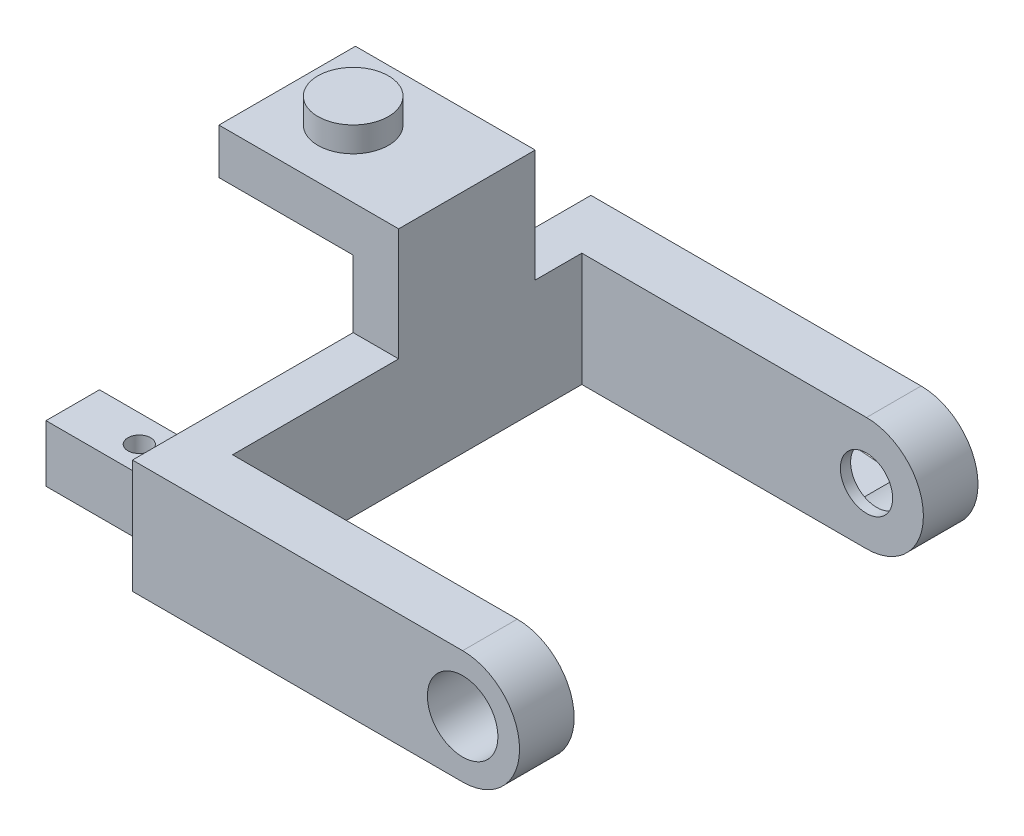
ISO-10303-21;
HEADER;
FILE_DESCRIPTION(('STEP AP214'),'2;1');
FILE_NAME('part.step','',(''),(''),'','','');
FILE_SCHEMA(('AUTOMOTIVE_DESIGN { 1 0 10303 214 1 1 1 1 }'));
ENDSEC;
DATA;
#1=APPLICATION_CONTEXT('core data for automotive mechanical design processes');
#2=APPLICATION_PROTOCOL_DEFINITION('international standard','automotive_design',2000,#1);
#3=PRODUCT_CONTEXT('',#1,'mechanical');
#4=PRODUCT('Part','Part','',(#3));
#5=PRODUCT_RELATED_PRODUCT_CATEGORY('part','',(#4));
#6=PRODUCT_DEFINITION_FORMATION('','',#4);
#7=PRODUCT_DEFINITION_CONTEXT('part definition',#1,'design');
#8=PRODUCT_DEFINITION('design','',#6,#7);
#9=PRODUCT_DEFINITION_SHAPE('','',#8);
#10=(LENGTH_UNIT() NAMED_UNIT(*) SI_UNIT(.MILLI.,.METRE.));
#11=(NAMED_UNIT(*) PLANE_ANGLE_UNIT() SI_UNIT($,.RADIAN.));
#12=(NAMED_UNIT(*) SI_UNIT($,.STERADIAN.) SOLID_ANGLE_UNIT());
#13=UNCERTAINTY_MEASURE_WITH_UNIT(LENGTH_MEASURE(1.E-05),#10,'distance_accuracy_value','');
#14=(GEOMETRIC_REPRESENTATION_CONTEXT(3) GLOBAL_UNCERTAINTY_ASSIGNED_CONTEXT((#13)) GLOBAL_UNIT_ASSIGNED_CONTEXT((#10,
#11,#12)) REPRESENTATION_CONTEXT('',''));
#15=CARTESIAN_POINT('',(0.,0.,0.));
#16=DIRECTION('',(0.,0.,1.));
#17=DIRECTION('',(1.,0.,0.));
#18=AXIS2_PLACEMENT_3D('',#15,#16,#17);
#19=CARTESIAN_POINT('',(-27.0232558139535,5.00000000000001,20.15));
#20=DIRECTION('',(0.,-1.,0.));
#21=DIRECTION('',(1.,0.,0.));
#22=AXIS2_PLACEMENT_3D('',#19,#20,#21);
#23=PLANE('',#22);
#24=DIRECTION('',(-1.,0.,0.));
#25=VECTOR('',#24,1.);
#26=CARTESIAN_POINT('',(-2.,5.00000000000001,-11.25));
#27=LINE('',#26,#25);
#28=CARTESIAN_POINT('',(2.,5.00000000000001,-11.25));
#29=VERTEX_POINT('',#28);
#30=CARTESIAN_POINT('',(-2.,5.00000000000001,-11.25));
#31=VERTEX_POINT('',#30);
#32=EDGE_CURVE('E237',#29,#31,#27,.T.);
#33=ORIENTED_EDGE('',*,*,#32,.F.);
#34=DIRECTION('',(0.,0.,-1.));
#35=VECTOR('',#34,1.);
#36=CARTESIAN_POINT('',(1.99999999999999,5.00000000000001,20.15));
#37=LINE('',#36,#35);
#38=CARTESIAN_POINT('',(2.,5.00000000000001,-15.35));
#39=VERTEX_POINT('',#38);
#40=EDGE_CURVE('E468',#29,#39,#37,.T.);
#41=ORIENTED_EDGE('',*,*,#40,.T.);
#42=DIRECTION('',(1.,0.,0.));
#43=VECTOR('',#42,1.);
#44=CARTESIAN_POINT('',(-27.0232558139535,5.00000000000001,-15.35));
#45=LINE('',#44,#43);
#46=CARTESIAN_POINT('',(27.0232558139535,5.00000000000002,-15.35));
#47=VERTEX_POINT('',#46);
#48=EDGE_CURVE('E11',#39,#47,#45,.T.);
#49=ORIENTED_EDGE('',*,*,#48,.T.);
#50=DIRECTION('',(0.,0.,-1.));
#51=VECTOR('',#50,1.);
#52=CARTESIAN_POINT('',(27.0232558139535,5.00000000000002,20.15));
#53=LINE('',#52,#51);
#54=CARTESIAN_POINT('',(27.0232558139535,5.00000000000002,-20.15));
#55=VERTEX_POINT('',#54);
#56=EDGE_CURVE('E448',#47,#55,#53,.T.);
#57=ORIENTED_EDGE('',*,*,#56,.T.);
#58=DIRECTION('',(-1.,0.,0.));
#59=VECTOR('',#58,1.);
#60=CARTESIAN_POINT('',(-27.0232558139535,5.00000000000001,-20.15));
#61=LINE('',#60,#59);
#62=CARTESIAN_POINT('',(-2.,5.00000000000001,-20.15));
#63=VERTEX_POINT('',#62);
#64=EDGE_CURVE('E441',#55,#63,#61,.T.);
#65=ORIENTED_EDGE('',*,*,#64,.T.);
#66=DIRECTION('',(0.,0.,1.));
#67=VECTOR('',#66,1.);
#68=CARTESIAN_POINT('',(-2.00000000000001,5.00000000000001,20.15));
#69=LINE('',#68,#67);
#70=EDGE_CURVE('E425',#63,#31,#69,.T.);
#71=ORIENTED_EDGE('',*,*,#70,.T.);
#72=EDGE_LOOP('',(#33,#41,#49,#57,#65,#71));
#73=FACE_BOUND('',#72,.T.);
#74=ADVANCED_FACE('F39',(#73),#23,.F.);
#75=DIRECTION('',(1.,0.,0.));
#76=VECTOR('',#75,1.);
#77=CARTESIAN_POINT('',(-2.,5.00000000000001,0.750000000000002));
#78=LINE('',#77,#76);
#79=CARTESIAN_POINT('',(-2.,5.00000000000001,0.750000000000001));
#80=VERTEX_POINT('',#79);
#81=CARTESIAN_POINT('',(2.,5.00000000000001,0.750000000000001));
#82=VERTEX_POINT('',#81);
#83=EDGE_CURVE('E504',#80,#82,#78,.T.);
#84=ORIENTED_EDGE('',*,*,#83,.F.);
#85=CARTESIAN_POINT('',(-2.,5.00000000000002,20.15));
#86=VERTEX_POINT('',#85);
#87=EDGE_CURVE('E402',#80,#86,#69,.T.);
#88=ORIENTED_EDGE('',*,*,#87,.T.);
#89=DIRECTION('',(-1.,0.,0.));
#90=VECTOR('',#89,1.);
#91=CARTESIAN_POINT('',(-27.0232558139535,5.00000000000001,20.15));
#92=LINE('',#91,#90);
#93=CARTESIAN_POINT('',(27.0232558139535,5.00000000000002,20.15));
#94=VERTEX_POINT('',#93);
#95=EDGE_CURVE('E444',#94,#86,#92,.T.);
#96=ORIENTED_EDGE('',*,*,#95,.F.);
#97=CARTESIAN_POINT('',(27.0232558139535,5.00000000000002,15.35));
#98=VERTEX_POINT('',#97);
#99=EDGE_CURVE('E459',#94,#98,#53,.T.);
#100=ORIENTED_EDGE('',*,*,#99,.T.);
#101=DIRECTION('',(-1.,0.,0.));
#102=VECTOR('',#101,1.);
#103=CARTESIAN_POINT('',(-27.0232558139535,5.00000000000001,15.35));
#104=LINE('',#103,#102);
#105=CARTESIAN_POINT('',(2.,5.00000000000001,15.35));
#106=VERTEX_POINT('',#105);
#107=EDGE_CURVE('E49',#98,#106,#104,.T.);
#108=ORIENTED_EDGE('',*,*,#107,.T.);
#109=EDGE_CURVE('E469',#106,#82,#37,.T.);
#110=ORIENTED_EDGE('',*,*,#109,.T.);
#111=EDGE_LOOP('',(#84,#88,#96,#100,#108,#110));
#112=FACE_BOUND('',#111,.T.);
#113=ADVANCED_FACE('F503',(#112),#23,.F.);
#114=CARTESIAN_POINT('',(27.0232558139535,0.,20.15));
#115=DIRECTION('',(0.,0.,-1.));
#116=DIRECTION('',(-1.,0.,0.));
#117=AXIS2_PLACEMENT_3D('',#114,#115,#116);
#118=CYLINDRICAL_SURFACE('',#117,5.00000000000002);
#119=ORIENTED_EDGE('',*,*,#56,.F.);
#120=CARTESIAN_POINT('',(27.0232558139535,0.,-15.35));
#121=DIRECTION('',(0.,0.,-1.));
#122=DIRECTION('',(-1.,0.,0.));
#123=AXIS2_PLACEMENT_3D('',#120,#121,#122);
#124=CIRCLE('',#123,5.00000000000002);
#125=CARTESIAN_POINT('',(27.0232558139535,-5.00000000000003,-15.35));
#126=VERTEX_POINT('',#125);
#127=EDGE_CURVE('E432',#47,#126,#124,.T.);
#128=ORIENTED_EDGE('',*,*,#127,.T.);
#129=DIRECTION('',(0.,0.,-1.));
#130=VECTOR('',#129,1.);
#131=CARTESIAN_POINT('',(27.0232558139535,-5.00000000000002,20.15));
#132=LINE('',#131,#130);
#133=CARTESIAN_POINT('',(27.0232558139535,-5.00000000000002,-20.15));
#134=VERTEX_POINT('',#133);
#135=EDGE_CURVE('E463',#126,#134,#132,.T.);
#136=ORIENTED_EDGE('',*,*,#135,.T.);
#137=CARTESIAN_POINT('',(27.0232558139535,0.,-20.15));
#138=DIRECTION('',(0.,0.,1.));
#139=DIRECTION('',(1.,0.,0.));
#140=AXIS2_PLACEMENT_3D('',#137,#138,#139);
#141=CIRCLE('',#140,5.00000000000002);
#142=EDGE_CURVE('E452',#134,#55,#141,.T.);
#143=ORIENTED_EDGE('',*,*,#142,.T.);
#144=EDGE_LOOP('',(#119,#128,#136,#143));
#145=FACE_BOUND('',#144,.T.);
#146=ADVANCED_FACE('F577',(#145),#118,.T.);
#147=CARTESIAN_POINT('',(-27.0232558139535,-5.00000000000002,20.15));
#148=DIRECTION('',(0.,1.,0.));
#149=DIRECTION('',(-1.,0.,0.));
#150=AXIS2_PLACEMENT_3D('',#147,#148,#149);
#151=PLANE('',#150);
#152=DIRECTION('',(1.,0.,0.));
#153=VECTOR('',#152,1.);
#154=CARTESIAN_POINT('',(-27.0232558139535,-5.00000000000002,20.15));
#155=LINE('',#154,#153);
#156=CARTESIAN_POINT('',(-2.,-5.00000000000003,20.15));
#157=VERTEX_POINT('',#156);
#158=CARTESIAN_POINT('',(27.0232558139535,-5.00000000000002,20.15));
#159=VERTEX_POINT('',#158);
#160=EDGE_CURVE('E437',#157,#159,#155,.T.);
#161=ORIENTED_EDGE('',*,*,#160,.F.);
#162=DIRECTION('',(0.,0.,-1.));
#163=VECTOR('',#162,1.);
#164=CARTESIAN_POINT('',(-2.,-5.00000000000003,20.15));
#165=LINE('',#164,#163);
#166=CARTESIAN_POINT('',(-1.99999999999999,-5.00000000000002,15.95));
#167=VERTEX_POINT('',#166);
#168=EDGE_CURVE('E391',#157,#167,#165,.T.);
#169=ORIENTED_EDGE('',*,*,#168,.T.);
#170=DIRECTION('',(-1.,0.,0.));
#171=VECTOR('',#170,1.);
#172=CARTESIAN_POINT('',(-2.,-5.00000000000002,15.95));
#173=LINE('',#172,#171);
#174=CARTESIAN_POINT('',(-13.8,-5.00000000000002,15.95));
#175=VERTEX_POINT('',#174);
#176=EDGE_CURVE('E250',#167,#175,#173,.T.);
#177=ORIENTED_EDGE('',*,*,#176,.T.);
#178=DIRECTION('',(0.,0.,-1.));
#179=VECTOR('',#178,1.);
#180=CARTESIAN_POINT('',(-13.8,-5.00000000000002,15.95));
#181=LINE('',#180,#179);
#182=CARTESIAN_POINT('',(-13.8,-5.00000000000002,11.25));
#183=VERTEX_POINT('',#182);
#184=EDGE_CURVE('E254',#175,#183,#181,.T.);
#185=ORIENTED_EDGE('',*,*,#184,.T.);
#186=DIRECTION('',(1.,0.,0.));
#187=VECTOR('',#186,1.);
#188=CARTESIAN_POINT('',(-13.8,-5.00000000000002,11.25));
#189=LINE('',#188,#187);
#190=CARTESIAN_POINT('',(-2.,-5.00000000000003,11.25));
#191=VERTEX_POINT('',#190);
#192=EDGE_CURVE('E255',#183,#191,#189,.T.);
#193=ORIENTED_EDGE('',*,*,#192,.T.);
#194=CARTESIAN_POINT('',(-2.,-5.00000000000003,-11.25));
#195=VERTEX_POINT('',#194);
#196=EDGE_CURVE('E396',#191,#195,#165,.T.);
#197=ORIENTED_EDGE('',*,*,#196,.T.);
#198=DIRECTION('',(-1.,0.,0.));
#199=VECTOR('',#198,1.);
#200=CARTESIAN_POINT('',(-13.8,-5.00000000000002,-11.25));
#201=LINE('',#200,#199);
#202=CARTESIAN_POINT('',(-13.8,-5.00000000000002,-11.25));
#203=VERTEX_POINT('',#202);
#204=EDGE_CURVE('E297',#195,#203,#201,.T.);
#205=ORIENTED_EDGE('',*,*,#204,.T.);
#206=DIRECTION('',(0.,0.,-1.));
#207=VECTOR('',#206,1.);
#208=CARTESIAN_POINT('',(-13.8,-5.00000000000002,-15.95));
#209=LINE('',#208,#207);
#210=CARTESIAN_POINT('',(-13.8,-5.00000000000002,-15.95));
#211=VERTEX_POINT('',#210);
#212=EDGE_CURVE('E298',#203,#211,#209,.T.);
#213=ORIENTED_EDGE('',*,*,#212,.T.);
#214=DIRECTION('',(1.,0.,0.));
#215=VECTOR('',#214,1.);
#216=CARTESIAN_POINT('',(-2.,-5.00000000000002,-15.95));
#217=LINE('',#216,#215);
#218=CARTESIAN_POINT('',(-2.,-5.00000000000003,-15.95));
#219=VERTEX_POINT('',#218);
#220=EDGE_CURVE('E292',#211,#219,#217,.T.);
#221=ORIENTED_EDGE('',*,*,#220,.T.);
#222=CARTESIAN_POINT('',(-2.,-5.00000000000003,-20.15));
#223=VERTEX_POINT('',#222);
#224=EDGE_CURVE('E397',#219,#223,#165,.T.);
#225=ORIENTED_EDGE('',*,*,#224,.T.);
#226=DIRECTION('',(1.,0.,0.));
#227=VECTOR('',#226,1.);
#228=CARTESIAN_POINT('',(-27.0232558139535,-5.00000000000002,-20.15));
#229=LINE('',#228,#227);
#230=EDGE_CURVE('E436',#223,#134,#229,.T.);
#231=ORIENTED_EDGE('',*,*,#230,.T.);
#232=ORIENTED_EDGE('',*,*,#135,.F.);
#233=DIRECTION('',(-1.,0.,0.));
#234=VECTOR('',#233,1.);
#235=CARTESIAN_POINT('',(27.0232558139535,-5.00000000000003,-15.35));
#236=LINE('',#235,#234);
#237=CARTESIAN_POINT('',(2.,-5.00000000000003,-15.35));
#238=VERTEX_POINT('',#237);
#239=EDGE_CURVE('E390',#126,#238,#236,.T.);
#240=ORIENTED_EDGE('',*,*,#239,.T.);
#241=DIRECTION('',(0.,0.,1.));
#242=VECTOR('',#241,1.);
#243=CARTESIAN_POINT('',(2.,-5.00000000000003,-15.35));
#244=LINE('',#243,#242);
#245=CARTESIAN_POINT('',(2.,-5.00000000000003,15.35));
#246=VERTEX_POINT('',#245);
#247=EDGE_CURVE('E409',#238,#246,#244,.T.);
#248=ORIENTED_EDGE('',*,*,#247,.T.);
#249=DIRECTION('',(1.,0.,0.));
#250=VECTOR('',#249,1.);
#251=CARTESIAN_POINT('',(2.,-5.00000000000003,15.35));
#252=LINE('',#251,#250);
#253=CARTESIAN_POINT('',(27.0232558139535,-5.00000000000003,15.35));
#254=VERTEX_POINT('',#253);
#255=EDGE_CURVE('E413',#246,#254,#252,.T.);
#256=ORIENTED_EDGE('',*,*,#255,.T.);
#257=EDGE_CURVE('E464',#159,#254,#132,.T.);
#258=ORIENTED_EDGE('',*,*,#257,.F.);
#259=EDGE_LOOP('',(#161,#169,#177,#185,#193,#197,#205,#213,#221,#225,#231,#232,#240,#248,#256,#258));
#260=FACE_BOUND('',#259,.T.);
#261=CARTESIAN_POINT('',(-7.9,-5.00000000000002,-13.55));
#262=DIRECTION('',(0.,1.,0.));
#263=DIRECTION('',(-1.,0.,0.));
#264=AXIS2_PLACEMENT_3D('',#261,#262,#263);
#265=CIRCLE('',#264,1.);
#266=CARTESIAN_POINT('',(-8.9,-5.00000000000002,-13.55));
#267=VERTEX_POINT('',#266);
#268=EDGE_CURVE('E296',#267,#267,#265,.F.);
#269=ORIENTED_EDGE('',*,*,#268,.F.);
#270=EDGE_LOOP('',(#269));
#271=FACE_BOUND('',#270,.T.);
#272=CARTESIAN_POINT('',(-7.9,-5.00000000000002,13.65));
#273=DIRECTION('',(0.,1.,0.));
#274=DIRECTION('',(-1.,0.,0.));
#275=AXIS2_PLACEMENT_3D('',#272,#273,#274);
#276=CIRCLE('',#275,1.);
#277=CARTESIAN_POINT('',(-8.9,-5.00000000000002,13.65));
#278=VERTEX_POINT('',#277);
#279=EDGE_CURVE('E253',#278,#278,#276,.F.);
#280=ORIENTED_EDGE('',*,*,#279,.F.);
#281=EDGE_LOOP('',(#280));
#282=FACE_BOUND('',#281,.T.);
#283=ADVANCED_FACE('F41',(#260,#271,#282),#151,.F.);
#284=ORIENTED_EDGE('',*,*,#257,.T.);
#285=CARTESIAN_POINT('',(27.0232558139535,0.,15.35));
#286=DIRECTION('',(0.,0.,1.));
#287=DIRECTION('',(1.,0.,0.));
#288=AXIS2_PLACEMENT_3D('',#285,#286,#287);
#289=CIRCLE('',#288,5.00000000000002);
#290=EDGE_CURVE('E428',#254,#98,#289,.T.);
#291=ORIENTED_EDGE('',*,*,#290,.T.);
#292=ORIENTED_EDGE('',*,*,#99,.F.);
#293=CARTESIAN_POINT('',(27.0232558139535,0.,20.15));
#294=DIRECTION('',(0.,0.,1.));
#295=DIRECTION('',(1.,0.,0.));
#296=AXIS2_PLACEMENT_3D('',#293,#294,#295);
#297=CIRCLE('',#296,5.00000000000002);
#298=EDGE_CURVE('E440',#159,#94,#297,.T.);
#299=ORIENTED_EDGE('',*,*,#298,.F.);
#300=EDGE_LOOP('',(#284,#291,#292,#299));
#301=FACE_BOUND('',#300,.T.);
#302=ADVANCED_FACE('F581',(#301),#118,.T.);
#303=CARTESIAN_POINT('',(-27.0232558139535,0.,20.15));
#304=DIRECTION('',(0.,0.,1.));
#305=DIRECTION('',(1.,0.,0.));
#306=AXIS2_PLACEMENT_3D('',#303,#304,#305);
#307=PLANE('',#306);
#308=CARTESIAN_POINT('',(27.0232558139535,0.,20.15));
#309=DIRECTION('',(0.,0.,1.));
#310=DIRECTION('',(1.,0.,0.));
#311=AXIS2_PLACEMENT_3D('',#308,#309,#310);
#312=CIRCLE('',#311,3.1);
#313=CARTESIAN_POINT('',(30.1232558139535,0.,20.15));
#314=VERTEX_POINT('',#313);
#315=EDGE_CURVE('E338',#314,#314,#312,.T.);
#316=ORIENTED_EDGE('',*,*,#315,.F.);
#317=EDGE_LOOP('',(#316));
#318=FACE_BOUND('',#317,.T.);
#319=DIRECTION('',(0.,1.,0.));
#320=VECTOR('',#319,1.);
#321=CARTESIAN_POINT('',(-2.,-5.00000000000003,20.15));
#322=LINE('',#321,#320);
#323=EDGE_CURVE('E395',#157,#86,#322,.T.);
#324=ORIENTED_EDGE('',*,*,#323,.F.);
#325=ORIENTED_EDGE('',*,*,#160,.T.);
#326=ORIENTED_EDGE('',*,*,#298,.T.);
#327=ORIENTED_EDGE('',*,*,#95,.T.);
#328=EDGE_LOOP('',(#324,#325,#326,#327));
#329=FACE_BOUND('',#328,.T.);
#330=ADVANCED_FACE('F583',(#318,#329),#307,.T.);
#331=CARTESIAN_POINT('',(-27.0232558139535,0.,-20.15));
#332=DIRECTION('',(0.,0.,1.));
#333=DIRECTION('',(1.,0.,0.));
#334=AXIS2_PLACEMENT_3D('',#331,#332,#333);
#335=PLANE('',#334);
#336=DIRECTION('',(0.997018781415782,-0.0771592476906667,0.));
#337=VECTOR('',#336,1.);
#338=CARTESIAN_POINT('',(-26.9320443119741,1.17859599822872,-20.15));
#339=LINE('',#338,#337);
#340=CARTESIAN_POINT('',(12.8482558139535,-1.9,-20.15));
#341=VERTEX_POINT('',#340);
#342=CARTESIAN_POINT('',(25.1237492990923,-2.85,-20.15));
#343=VERTEX_POINT('',#342);
#344=EDGE_CURVE('E346',#341,#343,#339,.T.);
#345=ORIENTED_EDGE('',*,*,#344,.T.);
#346=CARTESIAN_POINT('',(27.0232558139535,0.,-20.15));
#347=DIRECTION('',(0.,0.,1.));
#348=DIRECTION('',(1.,0.,0.));
#349=AXIS2_PLACEMENT_3D('',#346,#347,#348);
#350=CIRCLE('',#349,3.425);
#351=CARTESIAN_POINT('',(25.1237492990923,2.85,-20.15));
#352=VERTEX_POINT('',#351);
#353=EDGE_CURVE('E366',#343,#352,#350,.T.);
#354=ORIENTED_EDGE('',*,*,#353,.T.);
#355=DIRECTION('',(-0.997018781415782,-0.0771592476906667,0.));
#356=VECTOR('',#355,1.);
#357=CARTESIAN_POINT('',(-26.9320443119741,-1.17859599822872,-20.15));
#358=LINE('',#357,#356);
#359=CARTESIAN_POINT('',(12.8482558139535,1.9,-20.15));
#360=VERTEX_POINT('',#359);
#361=EDGE_CURVE('E370',#352,#360,#358,.T.);
#362=ORIENTED_EDGE('',*,*,#361,.T.);
#363=CARTESIAN_POINT('',(12.8482558139535,0.,-20.15));
#364=DIRECTION('',(0.,0.,1.));
#365=DIRECTION('',(1.,0.,0.));
#366=AXIS2_PLACEMENT_3D('',#363,#364,#365);
#367=CIRCLE('',#366,1.9);
#368=EDGE_CURVE('E353',#360,#341,#367,.T.);
#369=ORIENTED_EDGE('',*,*,#368,.T.);
#370=EDGE_LOOP('',(#345,#354,#362,#369));
#371=FACE_BOUND('',#370,.T.);
#372=ORIENTED_EDGE('',*,*,#230,.F.);
#373=DIRECTION('',(0.,1.,0.));
#374=VECTOR('',#373,1.);
#375=CARTESIAN_POINT('',(-2.,-5.00000000000003,-20.15));
#376=LINE('',#375,#374);
#377=EDGE_CURVE('E398',#223,#63,#376,.T.);
#378=ORIENTED_EDGE('',*,*,#377,.T.);
#379=ORIENTED_EDGE('',*,*,#64,.F.);
#380=ORIENTED_EDGE('',*,*,#142,.F.);
#381=EDGE_LOOP('',(#372,#378,#379,#380));
#382=FACE_BOUND('',#381,.T.);
#383=ADVANCED_FACE('F579',(#371,#382),#335,.F.);
#384=CARTESIAN_POINT('',(-2.,-5.00000000000003,20.15));
#385=DIRECTION('',(1.,0.,0.));
#386=DIRECTION('',(0.,1.,0.));
#387=AXIS2_PLACEMENT_3D('',#384,#385,#386);
#388=PLANE('',#387);
#389=DIRECTION('',(0.,-1.,0.));
#390=VECTOR('',#389,1.);
#391=CARTESIAN_POINT('',(-2.,14.9,0.750000000000002));
#392=LINE('',#391,#390);
#393=CARTESIAN_POINT('',(-2.,10.9,0.750000000000002));
#394=VERTEX_POINT('',#393);
#395=EDGE_CURVE('E57',#394,#80,#392,.T.);
#396=ORIENTED_EDGE('',*,*,#395,.F.);
#397=DIRECTION('',(0.,0.,-1.));
#398=VECTOR('',#397,1.);
#399=CARTESIAN_POINT('',(-2.,10.9,-11.25));
#400=LINE('',#399,#398);
#401=CARTESIAN_POINT('',(-2.,10.9,-11.25));
#402=VERTEX_POINT('',#401);
#403=EDGE_CURVE('E221',#394,#402,#400,.T.);
#404=ORIENTED_EDGE('',*,*,#403,.T.);
#405=DIRECTION('',(0.,-1.,0.));
#406=VECTOR('',#405,1.);
#407=CARTESIAN_POINT('',(-2.,14.9,-11.25));
#408=LINE('',#407,#406);
#409=EDGE_CURVE('E65',#402,#31,#408,.T.);
#410=ORIENTED_EDGE('',*,*,#409,.T.);
#411=ORIENTED_EDGE('',*,*,#70,.F.);
#412=ORIENTED_EDGE('',*,*,#377,.F.);
#413=ORIENTED_EDGE('',*,*,#224,.F.);
#414=DIRECTION('',(0.,1.,0.));
#415=VECTOR('',#414,1.);
#416=CARTESIAN_POINT('',(-2.,-17.7015747055237,-15.95));
#417=LINE('',#416,#415);
#418=CARTESIAN_POINT('',(-2.,0.,-15.95));
#419=VERTEX_POINT('',#418);
#420=EDGE_CURVE('E323',#219,#419,#417,.T.);
#421=ORIENTED_EDGE('',*,*,#420,.T.);
#422=DIRECTION('',(0.,0.,-1.));
#423=VECTOR('',#422,1.);
#424=CARTESIAN_POINT('',(-2.,0.,-11.25));
#425=LINE('',#424,#423);
#426=CARTESIAN_POINT('',(-2.,0.,-11.25));
#427=VERTEX_POINT('',#426);
#428=EDGE_CURVE('E307',#427,#419,#425,.T.);
#429=ORIENTED_EDGE('',*,*,#428,.F.);
#430=DIRECTION('',(0.,1.,0.));
#431=VECTOR('',#430,1.);
#432=CARTESIAN_POINT('',(-2.,-17.7015747055237,-11.25));
#433=LINE('',#432,#431);
#434=EDGE_CURVE('E301',#195,#427,#433,.T.);
#435=ORIENTED_EDGE('',*,*,#434,.F.);
#436=ORIENTED_EDGE('',*,*,#196,.F.);
#437=DIRECTION('',(0.,1.,0.));
#438=VECTOR('',#437,1.);
#439=CARTESIAN_POINT('',(-2.,-17.7015747055237,11.25));
#440=LINE('',#439,#438);
#441=CARTESIAN_POINT('',(-2.,0.,11.25));
#442=VERTEX_POINT('',#441);
#443=EDGE_CURVE('E279',#191,#442,#440,.T.);
#444=ORIENTED_EDGE('',*,*,#443,.T.);
#445=DIRECTION('',(0.,0.,-1.));
#446=VECTOR('',#445,1.);
#447=CARTESIAN_POINT('',(-2.,0.,11.25));
#448=LINE('',#447,#446);
#449=CARTESIAN_POINT('',(-1.99999999999999,0.,15.95));
#450=VERTEX_POINT('',#449);
#451=EDGE_CURVE('E269',#450,#442,#448,.T.);
#452=ORIENTED_EDGE('',*,*,#451,.F.);
#453=DIRECTION('',(0.,1.,0.));
#454=VECTOR('',#453,1.);
#455=CARTESIAN_POINT('',(-1.99999999999999,-17.7015747055237,15.95));
#456=LINE('',#455,#454);
#457=EDGE_CURVE('E283',#167,#450,#456,.T.);
#458=ORIENTED_EDGE('',*,*,#457,.F.);
#459=ORIENTED_EDGE('',*,*,#168,.F.);
#460=ORIENTED_EDGE('',*,*,#323,.T.);
#461=ORIENTED_EDGE('',*,*,#87,.F.);
#462=EDGE_LOOP('',(#396,#404,#410,#411,#412,#413,#421,#429,#435,#436,#444,#452,#458,#459,#460,#461));
#463=FACE_BOUND('',#462,.T.);
#464=ADVANCED_FACE('F228',(#463),#388,.F.);
#465=CARTESIAN_POINT('',(27.0232558139535,-5.00000000000003,-15.35));
#466=DIRECTION('',(0.,0.,-1.));
#467=DIRECTION('',(-1.,0.,0.));
#468=AXIS2_PLACEMENT_3D('',#465,#466,#467);
#469=PLANE('',#468);
#470=CARTESIAN_POINT('',(27.0232558139535,0.,-15.35));
#471=DIRECTION('',(0.,0.,-1.));
#472=DIRECTION('',(-1.,0.,0.));
#473=AXIS2_PLACEMENT_3D('',#470,#471,#472);
#474=CIRCLE('',#473,2.3);
#475=CARTESIAN_POINT('',(24.7232558139535,0.,-15.35));
#476=VERTEX_POINT('',#475);
#477=EDGE_CURVE('E342',#476,#476,#474,.T.);
#478=ORIENTED_EDGE('',*,*,#477,.T.);
#479=EDGE_LOOP('',(#478));
#480=FACE_BOUND('',#479,.T.);
#481=ORIENTED_EDGE('',*,*,#48,.F.);
#482=DIRECTION('',(0.,1.,0.));
#483=VECTOR('',#482,1.);
#484=CARTESIAN_POINT('',(2.,-5.00000000000003,-15.35));
#485=LINE('',#484,#483);
#486=EDGE_CURVE('E417',#238,#39,#485,.T.);
#487=ORIENTED_EDGE('',*,*,#486,.F.);
#488=ORIENTED_EDGE('',*,*,#239,.F.);
#489=ORIENTED_EDGE('',*,*,#127,.F.);
#490=EDGE_LOOP('',(#481,#487,#488,#489));
#491=FACE_BOUND('',#490,.T.);
#492=ADVANCED_FACE('F488',(#480,#491),#469,.F.);
#493=CARTESIAN_POINT('',(27.0232558139535,-5.00000000000003,15.35));
#494=DIRECTION('',(0.,0.,1.));
#495=DIRECTION('',(1.,0.,0.));
#496=AXIS2_PLACEMENT_3D('',#493,#494,#495);
#497=PLANE('',#496);
#498=CARTESIAN_POINT('',(27.0232558139535,0.,15.35));
#499=DIRECTION('',(0.,0.,1.));
#500=DIRECTION('',(1.,0.,0.));
#501=AXIS2_PLACEMENT_3D('',#498,#499,#500);
#502=CIRCLE('',#501,3.1);
#503=CARTESIAN_POINT('',(30.1232558139535,0.,15.35));
#504=VERTEX_POINT('',#503);
#505=EDGE_CURVE('E43',#504,#504,#502,.F.);
#506=ORIENTED_EDGE('',*,*,#505,.F.);
#507=EDGE_LOOP('',(#506));
#508=FACE_BOUND('',#507,.T.);
#509=ORIENTED_EDGE('',*,*,#255,.F.);
#510=DIRECTION('',(0.,1.,0.));
#511=VECTOR('',#510,1.);
#512=CARTESIAN_POINT('',(2.,-5.00000000000003,15.35));
#513=LINE('',#512,#511);
#514=EDGE_CURVE('E418',#246,#106,#513,.T.);
#515=ORIENTED_EDGE('',*,*,#514,.T.);
#516=ORIENTED_EDGE('',*,*,#107,.F.);
#517=ORIENTED_EDGE('',*,*,#290,.F.);
#518=EDGE_LOOP('',(#509,#515,#516,#517));
#519=FACE_BOUND('',#518,.T.);
#520=ADVANCED_FACE('F484',(#508,#519),#497,.F.);
#521=CARTESIAN_POINT('',(2.,-5.00000000000003,-15.35));
#522=DIRECTION('',(-1.,0.,0.));
#523=DIRECTION('',(0.,-1.,0.));
#524=AXIS2_PLACEMENT_3D('',#521,#522,#523);
#525=PLANE('',#524);
#526=DIRECTION('',(0.,-1.,0.));
#527=VECTOR('',#526,1.);
#528=CARTESIAN_POINT('',(2.,14.9,0.750000000000002));
#529=LINE('',#528,#527);
#530=CARTESIAN_POINT('',(2.,14.9,0.750000000000002));
#531=VERTEX_POINT('',#530);
#532=EDGE_CURVE('E246',#531,#82,#529,.T.);
#533=ORIENTED_EDGE('',*,*,#532,.T.);
#534=ORIENTED_EDGE('',*,*,#109,.F.);
#535=ORIENTED_EDGE('',*,*,#514,.F.);
#536=ORIENTED_EDGE('',*,*,#247,.F.);
#537=ORIENTED_EDGE('',*,*,#486,.T.);
#538=ORIENTED_EDGE('',*,*,#40,.F.);
#539=DIRECTION('',(0.,-1.,0.));
#540=VECTOR('',#539,1.);
#541=CARTESIAN_POINT('',(2.,14.9,-11.25));
#542=LINE('',#541,#540);
#543=CARTESIAN_POINT('',(2.,14.9,-11.25));
#544=VERTEX_POINT('',#543);
#545=EDGE_CURVE('E517',#544,#29,#542,.T.);
#546=ORIENTED_EDGE('',*,*,#545,.F.);
#547=DIRECTION('',(0.,0.,-1.));
#548=VECTOR('',#547,1.);
#549=CARTESIAN_POINT('',(2.,14.9,0.750000000000002));
#550=LINE('',#549,#548);
#551=EDGE_CURVE('E519',#531,#544,#550,.T.);
#552=ORIENTED_EDGE('',*,*,#551,.F.);
#553=EDGE_LOOP('',(#533,#534,#535,#536,#537,#538,#546,#552));
#554=FACE_BOUND('',#553,.T.);
#555=ADVANCED_FACE('F487',(#554),#525,.F.);
#556=CARTESIAN_POINT('',(-26.9320443119741,1.17859599822872,-16.25));
#557=DIRECTION('',(0.0771592476906667,0.997018781415782,0.));
#558=DIRECTION('',(-0.997018781415782,0.0771592476906667,0.));
#559=AXIS2_PLACEMENT_3D('',#556,#557,#558);
#560=PLANE('',#559);
#561=ORIENTED_EDGE('',*,*,#344,.F.);
#562=DIRECTION('',(0.,0.,-1.));
#563=VECTOR('',#562,1.);
#564=CARTESIAN_POINT('',(12.8482558139535,-1.9,-16.25));
#565=LINE('',#564,#563);
#566=CARTESIAN_POINT('',(12.8482558139535,-1.9,-16.25));
#567=VERTEX_POINT('',#566);
#568=EDGE_CURVE('E362',#567,#341,#565,.T.);
#569=ORIENTED_EDGE('',*,*,#568,.F.);
#570=DIRECTION('',(0.997018781415782,-0.0771592476906667,0.));
#571=VECTOR('',#570,1.);
#572=CARTESIAN_POINT('',(-26.9320443119741,1.17859599822872,-16.25));
#573=LINE('',#572,#571);
#574=CARTESIAN_POINT('',(25.1237492990923,-2.85,-16.25));
#575=VERTEX_POINT('',#574);
#576=EDGE_CURVE('E348',#567,#575,#573,.T.);
#577=ORIENTED_EDGE('',*,*,#576,.T.);
#578=DIRECTION('',(0.,0.,-1.));
#579=VECTOR('',#578,1.);
#580=CARTESIAN_POINT('',(25.1237492990923,-2.85,-16.25));
#581=LINE('',#580,#579);
#582=EDGE_CURVE('E386',#575,#343,#581,.T.);
#583=ORIENTED_EDGE('',*,*,#582,.T.);
#584=EDGE_LOOP('',(#561,#569,#577,#583));
#585=FACE_BOUND('',#584,.T.);
#586=ADVANCED_FACE('F619',(#585),#560,.T.);
#587=CARTESIAN_POINT('',(27.0232558139535,0.,-16.25));
#588=DIRECTION('',(0.,0.,-1.));
#589=DIRECTION('',(-1.,0.,0.));
#590=AXIS2_PLACEMENT_3D('',#587,#588,#589);
#591=CYLINDRICAL_SURFACE('',#590,3.425);
#592=ORIENTED_EDGE('',*,*,#353,.F.);
#593=ORIENTED_EDGE('',*,*,#582,.F.);
#594=CARTESIAN_POINT('',(27.0232558139535,0.,-16.25));
#595=DIRECTION('',(0.,0.,1.));
#596=DIRECTION('',(1.,0.,0.));
#597=AXIS2_PLACEMENT_3D('',#594,#595,#596);
#598=CIRCLE('',#597,3.425);
#599=CARTESIAN_POINT('',(25.1237492990923,2.85,-16.25));
#600=VERTEX_POINT('',#599);
#601=EDGE_CURVE('E352',#575,#600,#598,.T.);
#602=ORIENTED_EDGE('',*,*,#601,.T.);
#603=DIRECTION('',(0.,0.,-1.));
#604=VECTOR('',#603,1.);
#605=CARTESIAN_POINT('',(25.1237492990923,2.85,-16.25));
#606=LINE('',#605,#604);
#607=EDGE_CURVE('E383',#600,#352,#606,.T.);
#608=ORIENTED_EDGE('',*,*,#607,.T.);
#609=EDGE_LOOP('',(#592,#593,#602,#608));
#610=FACE_BOUND('',#609,.T.);
#611=ADVANCED_FACE('F623',(#610),#591,.F.);
#612=CARTESIAN_POINT('',(-26.9320443119741,-1.17859599822872,-16.25));
#613=DIRECTION('',(0.0771592476906667,-0.997018781415782,0.));
#614=DIRECTION('',(0.997018781415782,0.0771592476906667,0.));
#615=AXIS2_PLACEMENT_3D('',#612,#613,#614);
#616=PLANE('',#615);
#617=ORIENTED_EDGE('',*,*,#361,.F.);
#618=ORIENTED_EDGE('',*,*,#607,.F.);
#619=DIRECTION('',(-0.997018781415782,-0.0771592476906667,0.));
#620=VECTOR('',#619,1.);
#621=CARTESIAN_POINT('',(-26.9320443119741,-1.17859599822872,-16.25));
#622=LINE('',#621,#620);
#623=CARTESIAN_POINT('',(12.8482558139535,1.9,-16.25));
#624=VERTEX_POINT('',#623);
#625=EDGE_CURVE('E356',#600,#624,#622,.T.);
#626=ORIENTED_EDGE('',*,*,#625,.T.);
#627=DIRECTION('',(0.,0.,-1.));
#628=VECTOR('',#627,1.);
#629=CARTESIAN_POINT('',(12.8482558139535,1.9,-16.25));
#630=LINE('',#629,#628);
#631=EDGE_CURVE('E380',#624,#360,#630,.T.);
#632=ORIENTED_EDGE('',*,*,#631,.T.);
#633=EDGE_LOOP('',(#617,#618,#626,#632));
#634=FACE_BOUND('',#633,.T.);
#635=ADVANCED_FACE('F628',(#634),#616,.T.);
#636=CARTESIAN_POINT('',(12.8482558139535,0.,-16.25));
#637=DIRECTION('',(0.,0.,-1.));
#638=DIRECTION('',(-1.,0.,0.));
#639=AXIS2_PLACEMENT_3D('',#636,#637,#638);
#640=CYLINDRICAL_SURFACE('',#639,1.9);
#641=ORIENTED_EDGE('',*,*,#368,.F.);
#642=ORIENTED_EDGE('',*,*,#631,.F.);
#643=CARTESIAN_POINT('',(12.8482558139535,0.,-16.25));
#644=DIRECTION('',(0.,0.,1.));
#645=DIRECTION('',(1.,0.,0.));
#646=AXIS2_PLACEMENT_3D('',#643,#644,#645);
#647=CIRCLE('',#646,1.9);
#648=EDGE_CURVE('E359',#624,#567,#647,.T.);
#649=ORIENTED_EDGE('',*,*,#648,.T.);
#650=ORIENTED_EDGE('',*,*,#568,.T.);
#651=EDGE_LOOP('',(#641,#642,#649,#650));
#652=FACE_BOUND('',#651,.T.);
#653=ADVANCED_FACE('F634',(#652),#640,.F.);
#654=CARTESIAN_POINT('',(27.0232558139535,0.,-16.25));
#655=DIRECTION('',(0.,0.,1.));
#656=DIRECTION('',(1.,0.,0.));
#657=AXIS2_PLACEMENT_3D('',#654,#655,#656);
#658=PLANE('',#657);
#659=CARTESIAN_POINT('',(27.0232558139535,0.,-16.25));
#660=DIRECTION('',(0.,0.,1.));
#661=DIRECTION('',(1.,0.,0.));
#662=AXIS2_PLACEMENT_3D('',#659,#660,#661);
#663=CIRCLE('',#662,2.3);
#664=CARTESIAN_POINT('',(29.3232558139535,0.,-16.25));
#665=VERTEX_POINT('',#664);
#666=EDGE_CURVE('E347',#665,#665,#663,.T.);
#667=ORIENTED_EDGE('',*,*,#666,.T.);
#668=EDGE_LOOP('',(#667));
#669=FACE_BOUND('',#668,.T.);
#670=ORIENTED_EDGE('',*,*,#576,.F.);
#671=ORIENTED_EDGE('',*,*,#648,.F.);
#672=ORIENTED_EDGE('',*,*,#625,.F.);
#673=ORIENTED_EDGE('',*,*,#601,.F.);
#674=EDGE_LOOP('',(#670,#671,#672,#673));
#675=FACE_BOUND('',#674,.T.);
#676=ADVANCED_FACE('F638',(#669,#675),#658,.F.);
#677=CARTESIAN_POINT('',(27.0232558139535,0.,-20.15));
#678=DIRECTION('',(0.,0.,1.));
#679=DIRECTION('',(1.,0.,0.));
#680=AXIS2_PLACEMENT_3D('',#677,#678,#679);
#681=CYLINDRICAL_SURFACE('',#680,2.3);
#682=ORIENTED_EDGE('',*,*,#666,.F.);
#683=EDGE_LOOP('',(#682));
#684=FACE_BOUND('',#683,.T.);
#685=ORIENTED_EDGE('',*,*,#477,.F.);
#686=EDGE_LOOP('',(#685));
#687=FACE_BOUND('',#686,.T.);
#688=ADVANCED_FACE('F642',(#684,#687),#681,.F.);
#689=CARTESIAN_POINT('',(27.0232558139535,0.,20.15));
#690=DIRECTION('',(0.,0.,-1.));
#691=DIRECTION('',(-1.,0.,0.));
#692=AXIS2_PLACEMENT_3D('',#689,#690,#691);
#693=CYLINDRICAL_SURFACE('',#692,3.1);
#694=ORIENTED_EDGE('',*,*,#315,.T.);
#695=EDGE_LOOP('',(#694));
#696=FACE_BOUND('',#695,.T.);
#697=ORIENTED_EDGE('',*,*,#505,.T.);
#698=EDGE_LOOP('',(#697));
#699=FACE_BOUND('',#698,.T.);
#700=ADVANCED_FACE('F482',(#696,#699),#693,.F.);
#701=CARTESIAN_POINT('',(-2.,-17.7015747055237,-15.95));
#702=DIRECTION('',(0.,0.,-1.));
#703=DIRECTION('',(-1.,0.,0.));
#704=AXIS2_PLACEMENT_3D('',#701,#702,#703);
#705=PLANE('',#704);
#706=ORIENTED_EDGE('',*,*,#220,.F.);
#707=DIRECTION('',(0.,1.,0.));
#708=VECTOR('',#707,1.);
#709=CARTESIAN_POINT('',(-13.8,-17.7015747055237,-15.95));
#710=LINE('',#709,#708);
#711=CARTESIAN_POINT('',(-13.8,0.,-15.95));
#712=VERTEX_POINT('',#711);
#713=EDGE_CURVE('E330',#211,#712,#710,.T.);
#714=ORIENTED_EDGE('',*,*,#713,.T.);
#715=DIRECTION('',(-1.,0.,0.));
#716=VECTOR('',#715,1.);
#717=CARTESIAN_POINT('',(-2.,0.,-15.95));
#718=LINE('',#717,#716);
#719=EDGE_CURVE('E311',#419,#712,#718,.T.);
#720=ORIENTED_EDGE('',*,*,#719,.F.);
#721=ORIENTED_EDGE('',*,*,#420,.F.);
#722=EDGE_LOOP('',(#706,#714,#720,#721));
#723=FACE_BOUND('',#722,.T.);
#724=ADVANCED_FACE('F648',(#723),#705,.T.);
#725=CARTESIAN_POINT('',(-13.8,-17.7015747055237,-15.95));
#726=DIRECTION('',(-1.,0.,0.));
#727=DIRECTION('',(0.,0.,1.));
#728=AXIS2_PLACEMENT_3D('',#725,#726,#727);
#729=PLANE('',#728);
#730=ORIENTED_EDGE('',*,*,#212,.F.);
#731=DIRECTION('',(0.,1.,0.));
#732=VECTOR('',#731,1.);
#733=CARTESIAN_POINT('',(-13.8,-17.7015747055237,-11.25));
#734=LINE('',#733,#732);
#735=CARTESIAN_POINT('',(-13.8,0.,-11.25));
#736=VERTEX_POINT('',#735);
#737=EDGE_CURVE('E327',#203,#736,#734,.T.);
#738=ORIENTED_EDGE('',*,*,#737,.T.);
#739=DIRECTION('',(0.,0.,1.));
#740=VECTOR('',#739,1.);
#741=CARTESIAN_POINT('',(-13.8,0.,-15.95));
#742=LINE('',#741,#740);
#743=EDGE_CURVE('E315',#712,#736,#742,.T.);
#744=ORIENTED_EDGE('',*,*,#743,.F.);
#745=ORIENTED_EDGE('',*,*,#713,.F.);
#746=EDGE_LOOP('',(#730,#738,#744,#745));
#747=FACE_BOUND('',#746,.T.);
#748=ADVANCED_FACE('F652',(#747),#729,.T.);
#749=CARTESIAN_POINT('',(-13.8,-17.7015747055237,-11.25));
#750=DIRECTION('',(0.,0.,1.));
#751=DIRECTION('',(1.,0.,0.));
#752=AXIS2_PLACEMENT_3D('',#749,#750,#751);
#753=PLANE('',#752);
#754=ORIENTED_EDGE('',*,*,#204,.F.);
#755=ORIENTED_EDGE('',*,*,#434,.T.);
#756=DIRECTION('',(1.,0.,0.));
#757=VECTOR('',#756,1.);
#758=CARTESIAN_POINT('',(-13.8,0.,-11.25));
#759=LINE('',#758,#757);
#760=EDGE_CURVE('E319',#736,#427,#759,.T.);
#761=ORIENTED_EDGE('',*,*,#760,.F.);
#762=ORIENTED_EDGE('',*,*,#737,.F.);
#763=EDGE_LOOP('',(#754,#755,#761,#762));
#764=FACE_BOUND('',#763,.T.);
#765=ADVANCED_FACE('F656',(#764),#753,.T.);
#766=CARTESIAN_POINT('',(0.,0.,0.));
#767=DIRECTION('',(0.,1.,0.));
#768=DIRECTION('',(0.,0.,1.));
#769=AXIS2_PLACEMENT_3D('',#766,#767,#768);
#770=PLANE('',#769);
#771=CARTESIAN_POINT('',(-7.9,0.,-13.55));
#772=DIRECTION('',(0.,1.,0.));
#773=DIRECTION('',(0.,0.,1.));
#774=AXIS2_PLACEMENT_3D('',#771,#772,#773);
#775=CIRCLE('',#774,1.);
#776=CARTESIAN_POINT('',(-7.9,0.,-12.55));
#777=VERTEX_POINT('',#776);
#778=EDGE_CURVE('E291',#777,#777,#775,.T.);
#779=ORIENTED_EDGE('',*,*,#778,.F.);
#780=EDGE_LOOP('',(#779));
#781=FACE_BOUND('',#780,.T.);
#782=ORIENTED_EDGE('',*,*,#428,.T.);
#783=ORIENTED_EDGE('',*,*,#719,.T.);
#784=ORIENTED_EDGE('',*,*,#743,.T.);
#785=ORIENTED_EDGE('',*,*,#760,.T.);
#786=EDGE_LOOP('',(#782,#783,#784,#785));
#787=FACE_BOUND('',#786,.T.);
#788=ADVANCED_FACE('F660',(#781,#787),#770,.T.);
#789=CARTESIAN_POINT('',(-7.9,-17.7015747055237,-13.55));
#790=DIRECTION('',(0.,1.,0.));
#791=DIRECTION('',(0.,0.,1.));
#792=AXIS2_PLACEMENT_3D('',#789,#790,#791);
#793=CYLINDRICAL_SURFACE('',#792,1.);
#794=ORIENTED_EDGE('',*,*,#268,.T.);
#795=EDGE_LOOP('',(#794));
#796=FACE_BOUND('',#795,.T.);
#797=ORIENTED_EDGE('',*,*,#778,.T.);
#798=EDGE_LOOP('',(#797));
#799=FACE_BOUND('',#798,.T.);
#800=ADVANCED_FACE('F664',(#796,#799),#793,.F.);
#801=CARTESIAN_POINT('',(-1.99999999999999,-17.7015747055237,15.95));
#802=DIRECTION('',(0.,0.,1.));
#803=DIRECTION('',(1.,0.,0.));
#804=AXIS2_PLACEMENT_3D('',#801,#802,#803);
#805=PLANE('',#804);
#806=ORIENTED_EDGE('',*,*,#176,.F.);
#807=ORIENTED_EDGE('',*,*,#457,.T.);
#808=DIRECTION('',(1.,0.,0.));
#809=VECTOR('',#808,1.);
#810=CARTESIAN_POINT('',(-1.99999999999999,0.,15.95));
#811=LINE('',#810,#809);
#812=CARTESIAN_POINT('',(-13.8,0.,15.95));
#813=VERTEX_POINT('',#812);
#814=EDGE_CURVE('E265',#813,#450,#811,.T.);
#815=ORIENTED_EDGE('',*,*,#814,.F.);
#816=DIRECTION('',(0.,1.,0.));
#817=VECTOR('',#816,1.);
#818=CARTESIAN_POINT('',(-13.8,-17.7015747055237,15.95));
#819=LINE('',#818,#817);
#820=EDGE_CURVE('E276',#175,#813,#819,.T.);
#821=ORIENTED_EDGE('',*,*,#820,.F.);
#822=EDGE_LOOP('',(#806,#807,#815,#821));
#823=FACE_BOUND('',#822,.T.);
#824=ADVANCED_FACE('F668',(#823),#805,.T.);
#825=CARTESIAN_POINT('',(-13.8,-17.7015747055237,11.25));
#826=DIRECTION('',(0.,0.,-1.));
#827=DIRECTION('',(-1.,0.,0.));
#828=AXIS2_PLACEMENT_3D('',#825,#826,#827);
#829=PLANE('',#828);
#830=ORIENTED_EDGE('',*,*,#192,.F.);
#831=DIRECTION('',(0.,1.,0.));
#832=VECTOR('',#831,1.);
#833=CARTESIAN_POINT('',(-13.8,-17.7015747055237,11.25));
#834=LINE('',#833,#832);
#835=CARTESIAN_POINT('',(-13.8,0.,11.25));
#836=VERTEX_POINT('',#835);
#837=EDGE_CURVE('E259',#183,#836,#834,.T.);
#838=ORIENTED_EDGE('',*,*,#837,.T.);
#839=DIRECTION('',(-1.,0.,0.));
#840=VECTOR('',#839,1.);
#841=CARTESIAN_POINT('',(-13.8,0.,11.25));
#842=LINE('',#841,#840);
#843=EDGE_CURVE('E272',#442,#836,#842,.T.);
#844=ORIENTED_EDGE('',*,*,#843,.F.);
#845=ORIENTED_EDGE('',*,*,#443,.F.);
#846=EDGE_LOOP('',(#830,#838,#844,#845));
#847=FACE_BOUND('',#846,.T.);
#848=ADVANCED_FACE('F674',(#847),#829,.T.);
#849=CARTESIAN_POINT('',(-13.8,-17.7015747055237,15.95));
#850=DIRECTION('',(-1.,0.,0.));
#851=DIRECTION('',(0.,0.,1.));
#852=AXIS2_PLACEMENT_3D('',#849,#850,#851);
#853=PLANE('',#852);
#854=ORIENTED_EDGE('',*,*,#184,.F.);
#855=ORIENTED_EDGE('',*,*,#820,.T.);
#856=DIRECTION('',(0.,0.,1.));
#857=VECTOR('',#856,1.);
#858=CARTESIAN_POINT('',(-13.8,0.,15.95));
#859=LINE('',#858,#857);
#860=EDGE_CURVE('E244',#836,#813,#859,.T.);
#861=ORIENTED_EDGE('',*,*,#860,.F.);
#862=ORIENTED_EDGE('',*,*,#837,.F.);
#863=EDGE_LOOP('',(#854,#855,#861,#862));
#864=FACE_BOUND('',#863,.T.);
#865=ADVANCED_FACE('F670',(#864),#853,.T.);
#866=CARTESIAN_POINT('',(0.,0.,0.));
#867=DIRECTION('',(0.,-1.,0.));
#868=DIRECTION('',(0.,0.,-1.));
#869=AXIS2_PLACEMENT_3D('',#866,#867,#868);
#870=PLANE('',#869);
#871=CARTESIAN_POINT('',(-7.9,0.,13.65));
#872=DIRECTION('',(0.,1.,0.));
#873=DIRECTION('',(0.,0.,1.));
#874=AXIS2_PLACEMENT_3D('',#871,#872,#873);
#875=CIRCLE('',#874,1.);
#876=CARTESIAN_POINT('',(-7.9,0.,14.65));
#877=VERTEX_POINT('',#876);
#878=EDGE_CURVE('E239',#877,#877,#875,.T.);
#879=ORIENTED_EDGE('',*,*,#878,.F.);
#880=EDGE_LOOP('',(#879));
#881=FACE_BOUND('',#880,.T.);
#882=ORIENTED_EDGE('',*,*,#860,.T.);
#883=ORIENTED_EDGE('',*,*,#814,.T.);
#884=ORIENTED_EDGE('',*,*,#451,.T.);
#885=ORIENTED_EDGE('',*,*,#843,.T.);
#886=EDGE_LOOP('',(#882,#883,#884,#885));
#887=FACE_BOUND('',#886,.T.);
#888=ADVANCED_FACE('F673',(#881,#887),#870,.F.);
#889=CARTESIAN_POINT('',(-7.9,-17.7015747055237,13.65));
#890=DIRECTION('',(0.,1.,0.));
#891=DIRECTION('',(0.,0.,1.));
#892=AXIS2_PLACEMENT_3D('',#889,#890,#891);
#893=CYLINDRICAL_SURFACE('',#892,1.);
#894=ORIENTED_EDGE('',*,*,#279,.T.);
#895=EDGE_LOOP('',(#894));
#896=FACE_BOUND('',#895,.T.);
#897=ORIENTED_EDGE('',*,*,#878,.T.);
#898=EDGE_LOOP('',(#897));
#899=FACE_BOUND('',#898,.T.);
#900=ADVANCED_FACE('F684',(#896,#899),#893,.F.);
#901=CARTESIAN_POINT('',(-2.,14.9,-11.25));
#902=DIRECTION('',(0.,0.,1.));
#903=DIRECTION('',(1.,0.,0.));
#904=AXIS2_PLACEMENT_3D('',#901,#902,#903);
#905=PLANE('',#904);
#906=ORIENTED_EDGE('',*,*,#32,.T.);
#907=ORIENTED_EDGE('',*,*,#409,.F.);
#908=DIRECTION('',(-1.,0.,0.));
#909=VECTOR('',#908,1.);
#910=CARTESIAN_POINT('',(-13.8,10.9,-11.25));
#911=LINE('',#910,#909);
#912=CARTESIAN_POINT('',(-13.8,10.9,-11.25));
#913=VERTEX_POINT('',#912);
#914=EDGE_CURVE('E218',#402,#913,#911,.T.);
#915=ORIENTED_EDGE('',*,*,#914,.T.);
#916=DIRECTION('',(0.,1.,0.));
#917=VECTOR('',#916,1.);
#918=CARTESIAN_POINT('',(-13.8,10.9,-11.25));
#919=LINE('',#918,#917);
#920=CARTESIAN_POINT('',(-13.8,14.9,-11.25));
#921=VERTEX_POINT('',#920);
#922=EDGE_CURVE('E527',#913,#921,#919,.T.);
#923=ORIENTED_EDGE('',*,*,#922,.T.);
#924=DIRECTION('',(-1.,0.,0.));
#925=VECTOR('',#924,1.);
#926=CARTESIAN_POINT('',(-2.,14.9,-11.25));
#927=LINE('',#926,#925);
#928=EDGE_CURVE('E507',#544,#921,#927,.T.);
#929=ORIENTED_EDGE('',*,*,#928,.F.);
#930=ORIENTED_EDGE('',*,*,#545,.T.);
#931=EDGE_LOOP('',(#906,#907,#915,#923,#929,#930));
#932=FACE_BOUND('',#931,.T.);
#933=ADVANCED_FACE('F234',(#932),#905,.F.);
#934=CARTESIAN_POINT('',(-2.,14.9,0.750000000000002));
#935=DIRECTION('',(0.,0.,-1.));
#936=DIRECTION('',(-1.,0.,0.));
#937=AXIS2_PLACEMENT_3D('',#934,#935,#936);
#938=PLANE('',#937);
#939=ORIENTED_EDGE('',*,*,#83,.T.);
#940=ORIENTED_EDGE('',*,*,#532,.F.);
#941=DIRECTION('',(1.,0.,0.));
#942=VECTOR('',#941,1.);
#943=CARTESIAN_POINT('',(-2.,14.9,0.750000000000002));
#944=LINE('',#943,#942);
#945=CARTESIAN_POINT('',(-13.8,14.9,0.750000000000002));
#946=VERTEX_POINT('',#945);
#947=EDGE_CURVE('E511',#946,#531,#944,.T.);
#948=ORIENTED_EDGE('',*,*,#947,.F.);
#949=DIRECTION('',(0.,1.,0.));
#950=VECTOR('',#949,1.);
#951=CARTESIAN_POINT('',(-13.8,10.9,0.750000000000002));
#952=LINE('',#951,#950);
#953=CARTESIAN_POINT('',(-13.8,10.9,0.750000000000002));
#954=VERTEX_POINT('',#953);
#955=EDGE_CURVE('E513',#954,#946,#952,.T.);
#956=ORIENTED_EDGE('',*,*,#955,.F.);
#957=DIRECTION('',(1.,0.,0.));
#958=VECTOR('',#957,1.);
#959=CARTESIAN_POINT('',(-2.,10.9,0.750000000000002));
#960=LINE('',#959,#958);
#961=EDGE_CURVE('E530',#954,#394,#960,.T.);
#962=ORIENTED_EDGE('',*,*,#961,.T.);
#963=ORIENTED_EDGE('',*,*,#395,.T.);
#964=EDGE_LOOP('',(#939,#940,#948,#956,#962,#963));
#965=FACE_BOUND('',#964,.T.);
#966=ADVANCED_FACE('F505',(#965),#938,.F.);
#967=CARTESIAN_POINT('',(0.,14.9,0.));
#968=DIRECTION('',(0.,1.,0.));
#969=DIRECTION('',(0.,0.,1.));
#970=AXIS2_PLACEMENT_3D('',#967,#968,#969);
#971=PLANE('',#970);
#972=CARTESIAN_POINT('',(-7.9,14.9,-5.15));
#973=DIRECTION('',(0.,1.,0.));
#974=DIRECTION('',(0.,0.,1.));
#975=AXIS2_PLACEMENT_3D('',#972,#973,#974);
#976=CIRCLE('',#975,3.1);
#977=CARTESIAN_POINT('',(-7.9,14.9,-2.05));
#978=VERTEX_POINT('',#977);
#979=EDGE_CURVE('E541',#978,#978,#976,.T.);
#980=ORIENTED_EDGE('',*,*,#979,.F.);
#981=EDGE_LOOP('',(#980));
#982=FACE_BOUND('',#981,.T.);
#983=ORIENTED_EDGE('',*,*,#928,.T.);
#984=DIRECTION('',(0.,0.,1.));
#985=VECTOR('',#984,1.);
#986=CARTESIAN_POINT('',(-13.8,14.9,0.750000000000002));
#987=LINE('',#986,#985);
#988=EDGE_CURVE('E231',#921,#946,#987,.T.);
#989=ORIENTED_EDGE('',*,*,#988,.T.);
#990=ORIENTED_EDGE('',*,*,#947,.T.);
#991=ORIENTED_EDGE('',*,*,#551,.T.);
#992=EDGE_LOOP('',(#983,#989,#990,#991));
#993=FACE_BOUND('',#992,.T.);
#994=ADVANCED_FACE('F557',(#982,#993),#971,.T.);
#995=CARTESIAN_POINT('',(-13.8,10.9,0.750000000000002));
#996=DIRECTION('',(-1.,0.,0.));
#997=DIRECTION('',(0.,0.,1.));
#998=AXIS2_PLACEMENT_3D('',#995,#996,#997);
#999=PLANE('',#998);
#1000=ORIENTED_EDGE('',*,*,#988,.F.);
#1001=ORIENTED_EDGE('',*,*,#922,.F.);
#1002=DIRECTION('',(0.,0.,1.));
#1003=VECTOR('',#1002,1.);
#1004=CARTESIAN_POINT('',(-13.8,10.9,0.750000000000002));
#1005=LINE('',#1004,#1003);
#1006=EDGE_CURVE('E223',#913,#954,#1005,.T.);
#1007=ORIENTED_EDGE('',*,*,#1006,.T.);
#1008=ORIENTED_EDGE('',*,*,#955,.T.);
#1009=EDGE_LOOP('',(#1000,#1001,#1007,#1008));
#1010=FACE_BOUND('',#1009,.T.);
#1011=ADVANCED_FACE('F559',(#1010),#999,.T.);
#1012=CARTESIAN_POINT('',(0.,10.9,0.));
#1013=DIRECTION('',(0.,-1.,0.));
#1014=DIRECTION('',(0.,0.,-1.));
#1015=AXIS2_PLACEMENT_3D('',#1012,#1013,#1014);
#1016=PLANE('',#1015);
#1017=ORIENTED_EDGE('',*,*,#403,.F.);
#1018=ORIENTED_EDGE('',*,*,#961,.F.);
#1019=ORIENTED_EDGE('',*,*,#1006,.F.);
#1020=ORIENTED_EDGE('',*,*,#914,.F.);
#1021=EDGE_LOOP('',(#1017,#1018,#1019,#1020));
#1022=FACE_BOUND('',#1021,.T.);
#1023=ADVANCED_FACE('F219',(#1022),#1016,.T.);
#1024=CARTESIAN_POINT('',(-7.9,17.1,-5.15));
#1025=DIRECTION('',(0.,-1.,0.));
#1026=DIRECTION('',(0.,0.,-1.));
#1027=AXIS2_PLACEMENT_3D('',#1024,#1025,#1026);
#1028=CYLINDRICAL_SURFACE('',#1027,3.1);
#1029=CARTESIAN_POINT('',(-7.9,17.1,-5.15));
#1030=DIRECTION('',(0.,1.,0.));
#1031=DIRECTION('',(0.,0.,1.));
#1032=AXIS2_PLACEMENT_3D('',#1029,#1030,#1031);
#1033=CIRCLE('',#1032,3.1);
#1034=CARTESIAN_POINT('',(-7.9,17.1,-2.05));
#1035=VERTEX_POINT('',#1034);
#1036=EDGE_CURVE('E536',#1035,#1035,#1033,.T.);
#1037=ORIENTED_EDGE('',*,*,#1036,.F.);
#1038=EDGE_LOOP('',(#1037));
#1039=FACE_BOUND('',#1038,.T.);
#1040=ORIENTED_EDGE('',*,*,#979,.T.);
#1041=EDGE_LOOP('',(#1040));
#1042=FACE_BOUND('',#1041,.T.);
#1043=ADVANCED_FACE('F551',(#1039,#1042),#1028,.T.);
#1044=CARTESIAN_POINT('',(-7.9,17.1,-5.15));
#1045=DIRECTION('',(0.,1.,0.));
#1046=DIRECTION('',(0.,0.,1.));
#1047=AXIS2_PLACEMENT_3D('',#1044,#1045,#1046);
#1048=PLANE('',#1047);
#1049=ORIENTED_EDGE('',*,*,#1036,.T.);
#1050=EDGE_LOOP('',(#1049));
#1051=FACE_BOUND('',#1050,.T.);
#1052=ADVANCED_FACE('F549',(#1051),#1048,.T.);
#1053=CLOSED_SHELL('',(#74,#113,#146,#283,#302,#330,#383,#464,#492,#520,#555,#586,#611,#635,
#653,#676,#688,#700,#724,#748,#765,#788,#800,#824,#848,#865,#888,#900,#933,#966,#994,#1011,
#1023,#1043,#1052));
#1054=MANIFOLD_SOLID_BREP('B2',#1053);
#1055=ADVANCED_BREP_SHAPE_REPRESENTATION('',(#18,#1054),#14);
#1056=SHAPE_DEFINITION_REPRESENTATION(#9,#1055);
ENDSEC;
END-ISO-10303-21;
